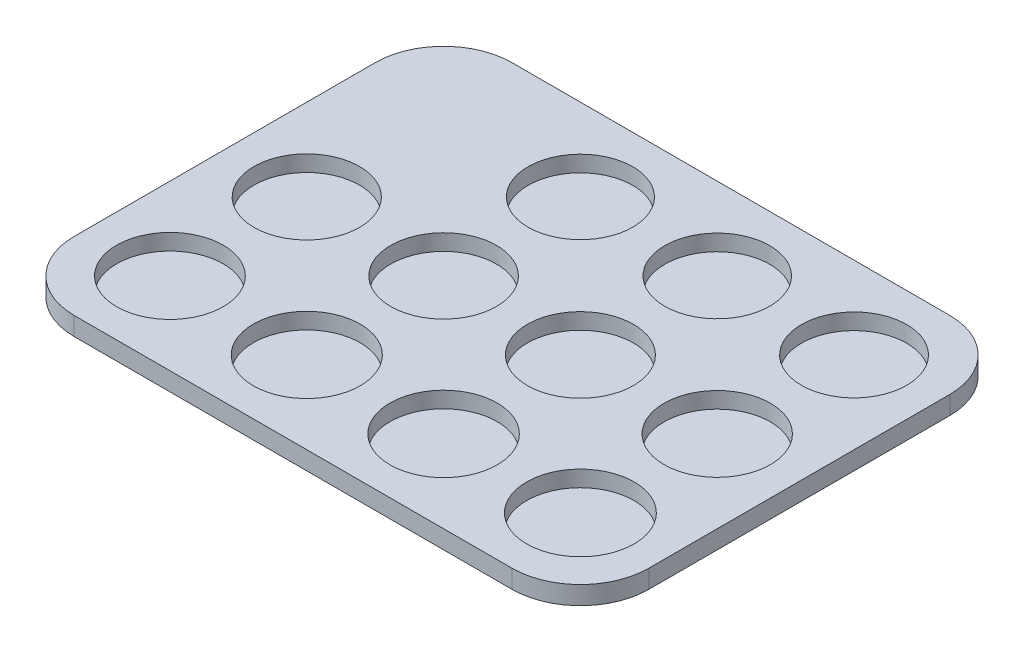
ISO-10303-21;
HEADER;
FILE_DESCRIPTION(('STEP AP214'),'2;1');
FILE_NAME('part.step','',(''),(''),'','','');
FILE_SCHEMA(('AUTOMOTIVE_DESIGN { 1 0 10303 214 1 1 1 1 }'));
ENDSEC;
DATA;
#1=APPLICATION_CONTEXT('core data for automotive mechanical design processes');
#2=APPLICATION_PROTOCOL_DEFINITION('international standard','automotive_design',2000,#1);
#3=PRODUCT_CONTEXT('',#1,'mechanical');
#4=PRODUCT('Part','Part','',(#3));
#5=PRODUCT_RELATED_PRODUCT_CATEGORY('part','',(#4));
#6=PRODUCT_DEFINITION_FORMATION('','',#4);
#7=PRODUCT_DEFINITION_CONTEXT('part definition',#1,'design');
#8=PRODUCT_DEFINITION('design','',#6,#7);
#9=PRODUCT_DEFINITION_SHAPE('','',#8);
#10=(LENGTH_UNIT() NAMED_UNIT(*) SI_UNIT(.MILLI.,.METRE.));
#11=(NAMED_UNIT(*) PLANE_ANGLE_UNIT() SI_UNIT($,.RADIAN.));
#12=(NAMED_UNIT(*) SI_UNIT($,.STERADIAN.) SOLID_ANGLE_UNIT());
#13=UNCERTAINTY_MEASURE_WITH_UNIT(LENGTH_MEASURE(1.E-05),#10,'distance_accuracy_value','');
#14=(GEOMETRIC_REPRESENTATION_CONTEXT(3) GLOBAL_UNCERTAINTY_ASSIGNED_CONTEXT((#13)) GLOBAL_UNIT_ASSIGNED_CONTEXT((#10,
#11,#12)) REPRESENTATION_CONTEXT('',''));
#15=CARTESIAN_POINT('',(0.,0.,0.));
#16=DIRECTION('',(0.,0.,1.));
#17=DIRECTION('',(1.,0.,0.));
#18=AXIS2_PLACEMENT_3D('',#15,#16,#17);
#19=CARTESIAN_POINT('',(0.,3.,0.));
#20=DIRECTION('',(0.,-1.,0.));
#21=DIRECTION('',(0.,0.,-1.));
#22=AXIS2_PLACEMENT_3D('',#19,#20,#21);
#23=PLANE('',#22);
#24=DIRECTION('',(-1.,0.,0.));
#25=VECTOR('',#24,1.);
#26=CARTESIAN_POINT('',(0.,3.,-81.28));
#27=LINE('',#26,#25);
#28=CARTESIAN_POINT('',(93.98,3.,-81.28));
#29=VERTEX_POINT('',#28);
#30=CARTESIAN_POINT('',(12.7,3.,-81.28));
#31=VERTEX_POINT('',#30);
#32=EDGE_CURVE('E130',#29,#31,#27,.T.);
#33=ORIENTED_EDGE('',*,*,#32,.T.);
#34=CARTESIAN_POINT('',(12.7,3.,-68.58));
#35=DIRECTION('',(0.,-1.,0.));
#36=DIRECTION('',(0.,0.,-1.));
#37=AXIS2_PLACEMENT_3D('',#34,#35,#36);
#38=CIRCLE('',#37,12.7);
#39=CARTESIAN_POINT('',(0.,3.,-68.58));
#40=VERTEX_POINT('',#39);
#41=EDGE_CURVE('E152',#31,#40,#38,.F.);
#42=ORIENTED_EDGE('',*,*,#41,.T.);
#43=DIRECTION('',(0.,0.,1.));
#44=VECTOR('',#43,1.);
#45=CARTESIAN_POINT('',(0.,3.,0.));
#46=LINE('',#45,#44);
#47=CARTESIAN_POINT('',(0.,3.,-12.7));
#48=VERTEX_POINT('',#47);
#49=EDGE_CURVE('E162',#40,#48,#46,.T.);
#50=ORIENTED_EDGE('',*,*,#49,.T.);
#51=CARTESIAN_POINT('',(12.7,3.,-12.7));
#52=DIRECTION('',(0.,-1.,0.));
#53=DIRECTION('',(0.,0.,-1.));
#54=AXIS2_PLACEMENT_3D('',#51,#52,#53);
#55=CIRCLE('',#54,12.7);
#56=CARTESIAN_POINT('',(12.7,3.,0.));
#57=VERTEX_POINT('',#56);
#58=EDGE_CURVE('E129',#48,#57,#55,.F.);
#59=ORIENTED_EDGE('',*,*,#58,.T.);
#60=DIRECTION('',(1.,0.,0.));
#61=VECTOR('',#60,1.);
#62=CARTESIAN_POINT('',(0.,3.,0.));
#63=LINE('',#62,#61);
#64=CARTESIAN_POINT('',(93.98,3.,0.));
#65=VERTEX_POINT('',#64);
#66=EDGE_CURVE('E161',#57,#65,#63,.T.);
#67=ORIENTED_EDGE('',*,*,#66,.T.);
#68=CARTESIAN_POINT('',(93.98,3.,-12.7));
#69=DIRECTION('',(0.,-1.,0.));
#70=DIRECTION('',(0.,0.,-1.));
#71=AXIS2_PLACEMENT_3D('',#68,#69,#70);
#72=CIRCLE('',#71,12.7);
#73=CARTESIAN_POINT('',(106.68,3.,-12.7));
#74=VERTEX_POINT('',#73);
#75=EDGE_CURVE('E61',#65,#74,#72,.F.);
#76=ORIENTED_EDGE('',*,*,#75,.T.);
#77=DIRECTION('',(0.,0.,-1.));
#78=VECTOR('',#77,1.);
#79=CARTESIAN_POINT('',(106.68,3.,0.));
#80=LINE('',#79,#78);
#81=CARTESIAN_POINT('',(106.68,3.,-68.58));
#82=VERTEX_POINT('',#81);
#83=EDGE_CURVE('E134',#74,#82,#80,.T.);
#84=ORIENTED_EDGE('',*,*,#83,.T.);
#85=CARTESIAN_POINT('',(93.98,3.,-68.58));
#86=DIRECTION('',(0.,-1.,0.));
#87=DIRECTION('',(0.,0.,-1.));
#88=AXIS2_PLACEMENT_3D('',#85,#86,#87);
#89=CIRCLE('',#88,12.7);
#90=EDGE_CURVE('E150',#82,#29,#89,.F.);
#91=ORIENTED_EDGE('',*,*,#90,.T.);
#92=EDGE_LOOP('',(#33,#42,#50,#59,#67,#76,#84,#91));
#93=FACE_BOUND('',#92,.T.);
#94=CARTESIAN_POINT('',(15.24,3.,-40.64));
#95=DIRECTION('',(0.,1.,0.));
#96=DIRECTION('',(0.,0.,1.));
#97=AXIS2_PLACEMENT_3D('',#94,#95,#96);
#98=CIRCLE('',#97,9.80000000000001);
#99=CARTESIAN_POINT('',(15.24,3.,-30.84));
#100=VERTEX_POINT('',#99);
#101=EDGE_CURVE('E164',#100,#100,#98,.T.);
#102=ORIENTED_EDGE('',*,*,#101,.F.);
#103=EDGE_LOOP('',(#102));
#104=FACE_BOUND('',#103,.T.);
#105=CARTESIAN_POINT('',(40.64,3.,-40.64));
#106=DIRECTION('',(0.,1.,0.));
#107=DIRECTION('',(0.,0.,1.));
#108=AXIS2_PLACEMENT_3D('',#105,#106,#107);
#109=CIRCLE('',#108,9.82500000000002);
#110=CARTESIAN_POINT('',(40.64,3.,-30.815));
#111=VERTEX_POINT('',#110);
#112=EDGE_CURVE('E170',#111,#111,#109,.T.);
#113=ORIENTED_EDGE('',*,*,#112,.F.);
#114=EDGE_LOOP('',(#113));
#115=FACE_BOUND('',#114,.T.);
#116=CARTESIAN_POINT('',(66.04,3.,-40.64));
#117=DIRECTION('',(0.,1.,0.));
#118=DIRECTION('',(0.,0.,1.));
#119=AXIS2_PLACEMENT_3D('',#116,#117,#118);
#120=CIRCLE('',#119,9.84999999999999);
#121=CARTESIAN_POINT('',(66.04,3.,-30.79));
#122=VERTEX_POINT('',#121);
#123=EDGE_CURVE('E176',#122,#122,#120,.T.);
#124=ORIENTED_EDGE('',*,*,#123,.F.);
#125=EDGE_LOOP('',(#124));
#126=FACE_BOUND('',#125,.T.);
#127=CARTESIAN_POINT('',(91.44,3.,-40.64));
#128=DIRECTION('',(0.,1.,0.));
#129=DIRECTION('',(0.,0.,1.));
#130=AXIS2_PLACEMENT_3D('',#127,#128,#129);
#131=CIRCLE('',#130,9.875);
#132=CARTESIAN_POINT('',(91.44,3.,-30.765));
#133=VERTEX_POINT('',#132);
#134=EDGE_CURVE('E182',#133,#133,#131,.T.);
#135=ORIENTED_EDGE('',*,*,#134,.F.);
#136=EDGE_LOOP('',(#135));
#137=FACE_BOUND('',#136,.T.);
#138=CARTESIAN_POINT('',(15.24,3.,-15.24));
#139=DIRECTION('',(0.,1.,0.));
#140=DIRECTION('',(0.,0.,1.));
#141=AXIS2_PLACEMENT_3D('',#138,#139,#140);
#142=CIRCLE('',#141,9.90000000000001);
#143=CARTESIAN_POINT('',(15.24,3.,-5.33999999999999));
#144=VERTEX_POINT('',#143);
#145=EDGE_CURVE('E188',#144,#144,#142,.T.);
#146=ORIENTED_EDGE('',*,*,#145,.F.);
#147=EDGE_LOOP('',(#146));
#148=FACE_BOUND('',#147,.T.);
#149=CARTESIAN_POINT('',(40.64,3.,-15.24));
#150=DIRECTION('',(0.,1.,0.));
#151=DIRECTION('',(0.,0.,1.));
#152=AXIS2_PLACEMENT_3D('',#149,#150,#151);
#153=CIRCLE('',#152,9.925);
#154=CARTESIAN_POINT('',(40.64,3.,-5.31499999999999));
#155=VERTEX_POINT('',#154);
#156=EDGE_CURVE('E194',#155,#155,#153,.T.);
#157=ORIENTED_EDGE('',*,*,#156,.F.);
#158=EDGE_LOOP('',(#157));
#159=FACE_BOUND('',#158,.T.);
#160=CARTESIAN_POINT('',(66.04,3.,-15.24));
#161=DIRECTION('',(0.,1.,0.));
#162=DIRECTION('',(0.,0.,1.));
#163=AXIS2_PLACEMENT_3D('',#160,#161,#162);
#164=CIRCLE('',#163,9.94999999999998);
#165=CARTESIAN_POINT('',(66.04,3.,-5.29000000000002));
#166=VERTEX_POINT('',#165);
#167=EDGE_CURVE('E200',#166,#166,#164,.T.);
#168=ORIENTED_EDGE('',*,*,#167,.F.);
#169=EDGE_LOOP('',(#168));
#170=FACE_BOUND('',#169,.T.);
#171=CARTESIAN_POINT('',(91.44,3.,-15.24));
#172=DIRECTION('',(0.,1.,0.));
#173=DIRECTION('',(0.,0.,1.));
#174=AXIS2_PLACEMENT_3D('',#171,#172,#173);
#175=CIRCLE('',#174,9.97500000000002);
#176=CARTESIAN_POINT('',(91.44,3.,-5.26499999999997));
#177=VERTEX_POINT('',#176);
#178=EDGE_CURVE('E206',#177,#177,#175,.T.);
#179=ORIENTED_EDGE('',*,*,#178,.F.);
#180=EDGE_LOOP('',(#179));
#181=FACE_BOUND('',#180,.T.);
#182=CARTESIAN_POINT('',(91.44,3.,-66.04));
#183=DIRECTION('',(0.,1.,0.));
#184=DIRECTION('',(0.,0.,1.));
#185=AXIS2_PLACEMENT_3D('',#182,#183,#184);
#186=CIRCLE('',#185,9.77500000000001);
#187=CARTESIAN_POINT('',(91.44,3.,-56.265));
#188=VERTEX_POINT('',#187);
#189=EDGE_CURVE('E212',#188,#188,#186,.T.);
#190=ORIENTED_EDGE('',*,*,#189,.F.);
#191=EDGE_LOOP('',(#190));
#192=FACE_BOUND('',#191,.T.);
#193=CARTESIAN_POINT('',(66.04,3.,-66.04));
#194=DIRECTION('',(0.,1.,0.));
#195=DIRECTION('',(0.,0.,1.));
#196=AXIS2_PLACEMENT_3D('',#193,#194,#195);
#197=CIRCLE('',#196,9.75000000000001);
#198=CARTESIAN_POINT('',(66.04,3.,-56.29));
#199=VERTEX_POINT('',#198);
#200=EDGE_CURVE('E218',#199,#199,#197,.T.);
#201=ORIENTED_EDGE('',*,*,#200,.F.);
#202=EDGE_LOOP('',(#201));
#203=FACE_BOUND('',#202,.T.);
#204=CARTESIAN_POINT('',(40.64,3.,-66.04));
#205=DIRECTION('',(0.,1.,0.));
#206=DIRECTION('',(0.,0.,1.));
#207=AXIS2_PLACEMENT_3D('',#204,#205,#206);
#208=CIRCLE('',#207,9.725);
#209=CARTESIAN_POINT('',(40.64,3.,-56.315));
#210=VERTEX_POINT('',#209);
#211=EDGE_CURVE('E224',#210,#210,#208,.T.);
#212=ORIENTED_EDGE('',*,*,#211,.F.);
#213=EDGE_LOOP('',(#212));
#214=FACE_BOUND('',#213,.T.);
#215=ADVANCED_FACE('F39',(#93,#104,#115,#126,#137,#148,#159,#170,#181,#192,#203,#214),#23,.F.);
#216=CARTESIAN_POINT('',(0.,3.,0.));
#217=DIRECTION('',(1.,0.,0.));
#218=DIRECTION('',(0.,0.,-1.));
#219=AXIS2_PLACEMENT_3D('',#216,#217,#218);
#220=PLANE('',#219);
#221=ORIENTED_EDGE('',*,*,#49,.F.);
#222=DIRECTION('',(0.,-1.,0.));
#223=VECTOR('',#222,1.);
#224=CARTESIAN_POINT('',(0.,3.,-68.58));
#225=LINE('',#224,#223);
#226=CARTESIAN_POINT('',(0.,-0.4,-68.58));
#227=VERTEX_POINT('',#226);
#228=EDGE_CURVE('E116',#40,#227,#225,.T.);
#229=ORIENTED_EDGE('',*,*,#228,.T.);
#230=DIRECTION('',(0.,0.,-1.));
#231=VECTOR('',#230,1.);
#232=CARTESIAN_POINT('',(0.,-0.4,0.));
#233=LINE('',#232,#231);
#234=CARTESIAN_POINT('',(0.,-0.4,-12.7));
#235=VERTEX_POINT('',#234);
#236=EDGE_CURVE('E108',#235,#227,#233,.T.);
#237=ORIENTED_EDGE('',*,*,#236,.F.);
#238=DIRECTION('',(0.,-1.,0.));
#239=VECTOR('',#238,1.);
#240=CARTESIAN_POINT('',(0.,3.,-12.7));
#241=LINE('',#240,#239);
#242=EDGE_CURVE('E122',#235,#48,#241,.F.);
#243=ORIENTED_EDGE('',*,*,#242,.T.);
#244=EDGE_LOOP('',(#221,#229,#237,#243));
#245=FACE_BOUND('',#244,.T.);
#246=ADVANCED_FACE('F121',(#245),#220,.F.);
#247=CARTESIAN_POINT('',(0.,3.,0.));
#248=DIRECTION('',(0.,0.,-1.));
#249=DIRECTION('',(-1.,0.,0.));
#250=AXIS2_PLACEMENT_3D('',#247,#248,#249);
#251=PLANE('',#250);
#252=DIRECTION('',(1.,0.,0.));
#253=VECTOR('',#252,1.);
#254=CARTESIAN_POINT('',(0.,-0.4,0.));
#255=LINE('',#254,#253);
#256=CARTESIAN_POINT('',(12.7,-0.4,0.));
#257=VERTEX_POINT('',#256);
#258=CARTESIAN_POINT('',(93.98,-0.4,0.));
#259=VERTEX_POINT('',#258);
#260=EDGE_CURVE('E110',#257,#259,#255,.T.);
#261=ORIENTED_EDGE('',*,*,#260,.T.);
#262=DIRECTION('',(0.,-1.,0.));
#263=VECTOR('',#262,1.);
#264=CARTESIAN_POINT('',(93.98,3.,0.));
#265=LINE('',#264,#263);
#266=EDGE_CURVE('E11',#259,#65,#265,.F.);
#267=ORIENTED_EDGE('',*,*,#266,.T.);
#268=ORIENTED_EDGE('',*,*,#66,.F.);
#269=DIRECTION('',(0.,-1.,0.));
#270=VECTOR('',#269,1.);
#271=CARTESIAN_POINT('',(12.7,3.,0.));
#272=LINE('',#271,#270);
#273=EDGE_CURVE('E47',#57,#257,#272,.T.);
#274=ORIENTED_EDGE('',*,*,#273,.T.);
#275=EDGE_LOOP('',(#261,#267,#268,#274));
#276=FACE_BOUND('',#275,.T.);
#277=ADVANCED_FACE('F159',(#276),#251,.F.);
#278=CARTESIAN_POINT('',(106.68,3.,0.));
#279=DIRECTION('',(-1.,0.,0.));
#280=DIRECTION('',(0.,0.,1.));
#281=AXIS2_PLACEMENT_3D('',#278,#279,#280);
#282=PLANE('',#281);
#283=DIRECTION('',(0.,0.,-1.));
#284=VECTOR('',#283,1.);
#285=CARTESIAN_POINT('',(106.68,-0.4,0.));
#286=LINE('',#285,#284);
#287=CARTESIAN_POINT('',(106.68,-0.4,-12.7));
#288=VERTEX_POINT('',#287);
#289=CARTESIAN_POINT('',(106.68,-0.4,-68.58));
#290=VERTEX_POINT('',#289);
#291=EDGE_CURVE('E233',#288,#290,#286,.T.);
#292=ORIENTED_EDGE('',*,*,#291,.T.);
#293=DIRECTION('',(0.,-1.,0.));
#294=VECTOR('',#293,1.);
#295=CARTESIAN_POINT('',(106.68,3.,-68.58));
#296=LINE('',#295,#294);
#297=EDGE_CURVE('E54',#290,#82,#296,.F.);
#298=ORIENTED_EDGE('',*,*,#297,.T.);
#299=ORIENTED_EDGE('',*,*,#83,.F.);
#300=DIRECTION('',(0.,-1.,0.));
#301=VECTOR('',#300,1.);
#302=CARTESIAN_POINT('',(106.68,3.,-12.7));
#303=LINE('',#302,#301);
#304=EDGE_CURVE('E154',#74,#288,#303,.T.);
#305=ORIENTED_EDGE('',*,*,#304,.T.);
#306=EDGE_LOOP('',(#292,#298,#299,#305));
#307=FACE_BOUND('',#306,.T.);
#308=ADVANCED_FACE('F236',(#307),#282,.F.);
#309=CARTESIAN_POINT('',(0.,3.,-81.28));
#310=DIRECTION('',(0.,0.,1.));
#311=DIRECTION('',(1.,0.,0.));
#312=AXIS2_PLACEMENT_3D('',#309,#310,#311);
#313=PLANE('',#312);
#314=DIRECTION('',(1.,0.,0.));
#315=VECTOR('',#314,1.);
#316=CARTESIAN_POINT('',(0.,-0.4,-81.28));
#317=LINE('',#316,#315);
#318=CARTESIAN_POINT('',(12.7,-0.4,-81.28));
#319=VERTEX_POINT('',#318);
#320=CARTESIAN_POINT('',(93.98,-0.4,-81.28));
#321=VERTEX_POINT('',#320);
#322=EDGE_CURVE('E126',#319,#321,#317,.T.);
#323=ORIENTED_EDGE('',*,*,#322,.F.);
#324=DIRECTION('',(0.,-1.,0.));
#325=VECTOR('',#324,1.);
#326=CARTESIAN_POINT('',(12.7,3.,-81.28));
#327=LINE('',#326,#325);
#328=EDGE_CURVE('E146',#319,#31,#327,.F.);
#329=ORIENTED_EDGE('',*,*,#328,.T.);
#330=ORIENTED_EDGE('',*,*,#32,.F.);
#331=DIRECTION('',(0.,-1.,0.));
#332=VECTOR('',#331,1.);
#333=CARTESIAN_POINT('',(93.98,3.,-81.28));
#334=LINE('',#333,#332);
#335=EDGE_CURVE('E143',#29,#321,#334,.T.);
#336=ORIENTED_EDGE('',*,*,#335,.T.);
#337=EDGE_LOOP('',(#323,#329,#330,#336));
#338=FACE_BOUND('',#337,.T.);
#339=ADVANCED_FACE('F247',(#338),#313,.F.);
#340=CARTESIAN_POINT('',(15.24,3.,-40.64));
#341=DIRECTION('',(0.,-1.,0.));
#342=DIRECTION('',(0.,0.,-1.));
#343=AXIS2_PLACEMENT_3D('',#340,#341,#342);
#344=CYLINDRICAL_SURFACE('',#343,9.80000000000001);
#345=ORIENTED_EDGE('',*,*,#101,.T.);
#346=EDGE_LOOP('',(#345));
#347=FACE_BOUND('',#346,.T.);
#348=CARTESIAN_POINT('',(15.24,0.,-40.64));
#349=DIRECTION('',(0.,1.,0.));
#350=DIRECTION('',(0.,0.,1.));
#351=AXIS2_PLACEMENT_3D('',#348,#349,#350);
#352=CIRCLE('',#351,9.80000000000001);
#353=CARTESIAN_POINT('',(15.24,0.,-30.84));
#354=VERTEX_POINT('',#353);
#355=EDGE_CURVE('E167',#354,#354,#352,.T.);
#356=ORIENTED_EDGE('',*,*,#355,.F.);
#357=EDGE_LOOP('',(#356));
#358=FACE_BOUND('',#357,.T.);
#359=ADVANCED_FACE('F269',(#347,#358),#344,.F.);
#360=CARTESIAN_POINT('',(40.64,3.,-40.64));
#361=DIRECTION('',(0.,-1.,0.));
#362=DIRECTION('',(0.,0.,-1.));
#363=AXIS2_PLACEMENT_3D('',#360,#361,#362);
#364=CYLINDRICAL_SURFACE('',#363,9.82500000000002);
#365=ORIENTED_EDGE('',*,*,#112,.T.);
#366=EDGE_LOOP('',(#365));
#367=FACE_BOUND('',#366,.T.);
#368=CARTESIAN_POINT('',(40.64,0.,-40.64));
#369=DIRECTION('',(0.,1.,0.));
#370=DIRECTION('',(0.,0.,1.));
#371=AXIS2_PLACEMENT_3D('',#368,#369,#370);
#372=CIRCLE('',#371,9.82500000000002);
#373=CARTESIAN_POINT('',(40.64,0.,-30.815));
#374=VERTEX_POINT('',#373);
#375=EDGE_CURVE('E173',#374,#374,#372,.T.);
#376=ORIENTED_EDGE('',*,*,#375,.F.);
#377=EDGE_LOOP('',(#376));
#378=FACE_BOUND('',#377,.T.);
#379=ADVANCED_FACE('F295',(#367,#378),#364,.F.);
#380=CARTESIAN_POINT('',(66.04,3.,-40.64));
#381=DIRECTION('',(0.,-1.,0.));
#382=DIRECTION('',(0.,0.,-1.));
#383=AXIS2_PLACEMENT_3D('',#380,#381,#382);
#384=CYLINDRICAL_SURFACE('',#383,9.84999999999999);
#385=ORIENTED_EDGE('',*,*,#123,.T.);
#386=EDGE_LOOP('',(#385));
#387=FACE_BOUND('',#386,.T.);
#388=CARTESIAN_POINT('',(66.04,0.,-40.64));
#389=DIRECTION('',(0.,1.,0.));
#390=DIRECTION('',(0.,0.,1.));
#391=AXIS2_PLACEMENT_3D('',#388,#389,#390);
#392=CIRCLE('',#391,9.84999999999999);
#393=CARTESIAN_POINT('',(66.04,0.,-30.79));
#394=VERTEX_POINT('',#393);
#395=EDGE_CURVE('E179',#394,#394,#392,.T.);
#396=ORIENTED_EDGE('',*,*,#395,.F.);
#397=EDGE_LOOP('',(#396));
#398=FACE_BOUND('',#397,.T.);
#399=ADVANCED_FACE('F302',(#387,#398),#384,.F.);
#400=CARTESIAN_POINT('',(91.44,3.,-40.64));
#401=DIRECTION('',(0.,-1.,0.));
#402=DIRECTION('',(0.,0.,-1.));
#403=AXIS2_PLACEMENT_3D('',#400,#401,#402);
#404=CYLINDRICAL_SURFACE('',#403,9.875);
#405=ORIENTED_EDGE('',*,*,#134,.T.);
#406=EDGE_LOOP('',(#405));
#407=FACE_BOUND('',#406,.T.);
#408=CARTESIAN_POINT('',(91.44,0.,-40.64));
#409=DIRECTION('',(0.,1.,0.));
#410=DIRECTION('',(0.,0.,1.));
#411=AXIS2_PLACEMENT_3D('',#408,#409,#410);
#412=CIRCLE('',#411,9.875);
#413=CARTESIAN_POINT('',(91.44,0.,-30.765));
#414=VERTEX_POINT('',#413);
#415=EDGE_CURVE('E185',#414,#414,#412,.T.);
#416=ORIENTED_EDGE('',*,*,#415,.F.);
#417=EDGE_LOOP('',(#416));
#418=FACE_BOUND('',#417,.T.);
#419=ADVANCED_FACE('F309',(#407,#418),#404,.F.);
#420=CARTESIAN_POINT('',(15.24,3.,-15.24));
#421=DIRECTION('',(0.,-1.,0.));
#422=DIRECTION('',(0.,0.,-1.));
#423=AXIS2_PLACEMENT_3D('',#420,#421,#422);
#424=CYLINDRICAL_SURFACE('',#423,9.90000000000001);
#425=ORIENTED_EDGE('',*,*,#145,.T.);
#426=EDGE_LOOP('',(#425));
#427=FACE_BOUND('',#426,.T.);
#428=CARTESIAN_POINT('',(15.24,0.,-15.24));
#429=DIRECTION('',(0.,1.,0.));
#430=DIRECTION('',(0.,0.,1.));
#431=AXIS2_PLACEMENT_3D('',#428,#429,#430);
#432=CIRCLE('',#431,9.90000000000001);
#433=CARTESIAN_POINT('',(15.24,0.,-5.33999999999999));
#434=VERTEX_POINT('',#433);
#435=EDGE_CURVE('E191',#434,#434,#432,.T.);
#436=ORIENTED_EDGE('',*,*,#435,.F.);
#437=EDGE_LOOP('',(#436));
#438=FACE_BOUND('',#437,.T.);
#439=ADVANCED_FACE('F317',(#427,#438),#424,.F.);
#440=CARTESIAN_POINT('',(40.64,3.,-15.24));
#441=DIRECTION('',(0.,-1.,0.));
#442=DIRECTION('',(0.,0.,-1.));
#443=AXIS2_PLACEMENT_3D('',#440,#441,#442);
#444=CYLINDRICAL_SURFACE('',#443,9.925);
#445=ORIENTED_EDGE('',*,*,#156,.T.);
#446=EDGE_LOOP('',(#445));
#447=FACE_BOUND('',#446,.T.);
#448=CARTESIAN_POINT('',(40.64,0.,-15.24));
#449=DIRECTION('',(0.,1.,0.));
#450=DIRECTION('',(0.,0.,1.));
#451=AXIS2_PLACEMENT_3D('',#448,#449,#450);
#452=CIRCLE('',#451,9.925);
#453=CARTESIAN_POINT('',(40.64,0.,-5.31499999999999));
#454=VERTEX_POINT('',#453);
#455=EDGE_CURVE('E197',#454,#454,#452,.T.);
#456=ORIENTED_EDGE('',*,*,#455,.F.);
#457=EDGE_LOOP('',(#456));
#458=FACE_BOUND('',#457,.T.);
#459=ADVANCED_FACE('F325',(#447,#458),#444,.F.);
#460=CARTESIAN_POINT('',(66.04,3.,-15.24));
#461=DIRECTION('',(0.,-1.,0.));
#462=DIRECTION('',(0.,0.,-1.));
#463=AXIS2_PLACEMENT_3D('',#460,#461,#462);
#464=CYLINDRICAL_SURFACE('',#463,9.94999999999998);
#465=ORIENTED_EDGE('',*,*,#167,.T.);
#466=EDGE_LOOP('',(#465));
#467=FACE_BOUND('',#466,.T.);
#468=CARTESIAN_POINT('',(66.04,0.,-15.24));
#469=DIRECTION('',(0.,1.,0.));
#470=DIRECTION('',(0.,0.,1.));
#471=AXIS2_PLACEMENT_3D('',#468,#469,#470);
#472=CIRCLE('',#471,9.94999999999998);
#473=CARTESIAN_POINT('',(66.04,0.,-5.29000000000002));
#474=VERTEX_POINT('',#473);
#475=EDGE_CURVE('E203',#474,#474,#472,.T.);
#476=ORIENTED_EDGE('',*,*,#475,.F.);
#477=EDGE_LOOP('',(#476));
#478=FACE_BOUND('',#477,.T.);
#479=ADVANCED_FACE('F333',(#467,#478),#464,.F.);
#480=CARTESIAN_POINT('',(91.44,3.,-15.24));
#481=DIRECTION('',(0.,-1.,0.));
#482=DIRECTION('',(0.,0.,-1.));
#483=AXIS2_PLACEMENT_3D('',#480,#481,#482);
#484=CYLINDRICAL_SURFACE('',#483,9.97500000000002);
#485=ORIENTED_EDGE('',*,*,#178,.T.);
#486=EDGE_LOOP('',(#485));
#487=FACE_BOUND('',#486,.T.);
#488=CARTESIAN_POINT('',(91.44,0.,-15.24));
#489=DIRECTION('',(0.,1.,0.));
#490=DIRECTION('',(0.,0.,1.));
#491=AXIS2_PLACEMENT_3D('',#488,#489,#490);
#492=CIRCLE('',#491,9.97500000000002);
#493=CARTESIAN_POINT('',(91.44,0.,-5.26499999999997));
#494=VERTEX_POINT('',#493);
#495=EDGE_CURVE('E209',#494,#494,#492,.T.);
#496=ORIENTED_EDGE('',*,*,#495,.F.);
#497=EDGE_LOOP('',(#496));
#498=FACE_BOUND('',#497,.T.);
#499=ADVANCED_FACE('F341',(#487,#498),#484,.F.);
#500=CARTESIAN_POINT('',(91.44,3.,-66.04));
#501=DIRECTION('',(0.,-1.,0.));
#502=DIRECTION('',(0.,0.,-1.));
#503=AXIS2_PLACEMENT_3D('',#500,#501,#502);
#504=CYLINDRICAL_SURFACE('',#503,9.77500000000001);
#505=ORIENTED_EDGE('',*,*,#189,.T.);
#506=EDGE_LOOP('',(#505));
#507=FACE_BOUND('',#506,.T.);
#508=CARTESIAN_POINT('',(91.44,0.,-66.04));
#509=DIRECTION('',(0.,1.,0.));
#510=DIRECTION('',(0.,0.,1.));
#511=AXIS2_PLACEMENT_3D('',#508,#509,#510);
#512=CIRCLE('',#511,9.77500000000001);
#513=CARTESIAN_POINT('',(91.44,0.,-56.265));
#514=VERTEX_POINT('',#513);
#515=EDGE_CURVE('E215',#514,#514,#512,.T.);
#516=ORIENTED_EDGE('',*,*,#515,.F.);
#517=EDGE_LOOP('',(#516));
#518=FACE_BOUND('',#517,.T.);
#519=ADVANCED_FACE('F349',(#507,#518),#504,.F.);
#520=CARTESIAN_POINT('',(66.04,3.,-66.04));
#521=DIRECTION('',(0.,-1.,0.));
#522=DIRECTION('',(0.,0.,-1.));
#523=AXIS2_PLACEMENT_3D('',#520,#521,#522);
#524=CYLINDRICAL_SURFACE('',#523,9.75000000000001);
#525=ORIENTED_EDGE('',*,*,#200,.T.);
#526=EDGE_LOOP('',(#525));
#527=FACE_BOUND('',#526,.T.);
#528=CARTESIAN_POINT('',(66.04,0.,-66.04));
#529=DIRECTION('',(0.,1.,0.));
#530=DIRECTION('',(0.,0.,1.));
#531=AXIS2_PLACEMENT_3D('',#528,#529,#530);
#532=CIRCLE('',#531,9.75000000000001);
#533=CARTESIAN_POINT('',(66.04,0.,-56.29));
#534=VERTEX_POINT('',#533);
#535=EDGE_CURVE('E221',#534,#534,#532,.T.);
#536=ORIENTED_EDGE('',*,*,#535,.F.);
#537=EDGE_LOOP('',(#536));
#538=FACE_BOUND('',#537,.T.);
#539=ADVANCED_FACE('F357',(#527,#538),#524,.F.);
#540=CARTESIAN_POINT('',(40.64,3.,-66.04));
#541=DIRECTION('',(0.,-1.,0.));
#542=DIRECTION('',(0.,0.,-1.));
#543=AXIS2_PLACEMENT_3D('',#540,#541,#542);
#544=CYLINDRICAL_SURFACE('',#543,9.725);
#545=ORIENTED_EDGE('',*,*,#211,.T.);
#546=EDGE_LOOP('',(#545));
#547=FACE_BOUND('',#546,.T.);
#548=CARTESIAN_POINT('',(40.64,0.,-66.04));
#549=DIRECTION('',(0.,1.,0.));
#550=DIRECTION('',(0.,0.,1.));
#551=AXIS2_PLACEMENT_3D('',#548,#549,#550);
#552=CIRCLE('',#551,9.725);
#553=CARTESIAN_POINT('',(40.64,0.,-56.315));
#554=VERTEX_POINT('',#553);
#555=EDGE_CURVE('E125',#554,#554,#552,.T.);
#556=ORIENTED_EDGE('',*,*,#555,.F.);
#557=EDGE_LOOP('',(#556));
#558=FACE_BOUND('',#557,.T.);
#559=ADVANCED_FACE('F365',(#547,#558),#544,.F.);
#560=CARTESIAN_POINT('',(0.,0.,0.));
#561=DIRECTION('',(0.,1.,0.));
#562=DIRECTION('',(0.,0.,1.));
#563=AXIS2_PLACEMENT_3D('',#560,#561,#562);
#564=PLANE('',#563);
#565=ORIENTED_EDGE('',*,*,#555,.T.);
#566=EDGE_LOOP('',(#565));
#567=FACE_BOUND('',#566,.T.);
#568=ADVANCED_FACE('F373',(#567),#564,.T.);
#569=ORIENTED_EDGE('',*,*,#515,.T.);
#570=EDGE_LOOP('',(#569));
#571=FACE_BOUND('',#570,.T.);
#572=ADVANCED_FACE('F381',(#571),#564,.T.);
#573=ORIENTED_EDGE('',*,*,#475,.T.);
#574=EDGE_LOOP('',(#573));
#575=FACE_BOUND('',#574,.T.);
#576=ADVANCED_FACE('F389',(#575),#564,.T.);
#577=ORIENTED_EDGE('',*,*,#435,.T.);
#578=EDGE_LOOP('',(#577));
#579=FACE_BOUND('',#578,.T.);
#580=ADVANCED_FACE('F396',(#579),#564,.T.);
#581=ORIENTED_EDGE('',*,*,#395,.T.);
#582=EDGE_LOOP('',(#581));
#583=FACE_BOUND('',#582,.T.);
#584=ADVANCED_FACE('F403',(#583),#564,.T.);
#585=ORIENTED_EDGE('',*,*,#355,.T.);
#586=EDGE_LOOP('',(#585));
#587=FACE_BOUND('',#586,.T.);
#588=ADVANCED_FACE('F410',(#587),#564,.T.);
#589=ORIENTED_EDGE('',*,*,#375,.T.);
#590=EDGE_LOOP('',(#589));
#591=FACE_BOUND('',#590,.T.);
#592=ADVANCED_FACE('F417',(#591),#564,.T.);
#593=ORIENTED_EDGE('',*,*,#415,.T.);
#594=EDGE_LOOP('',(#593));
#595=FACE_BOUND('',#594,.T.);
#596=ADVANCED_FACE('F424',(#595),#564,.T.);
#597=ORIENTED_EDGE('',*,*,#455,.T.);
#598=EDGE_LOOP('',(#597));
#599=FACE_BOUND('',#598,.T.);
#600=ADVANCED_FACE('F431',(#599),#564,.T.);
#601=ORIENTED_EDGE('',*,*,#495,.T.);
#602=EDGE_LOOP('',(#601));
#603=FACE_BOUND('',#602,.T.);
#604=ADVANCED_FACE('F438',(#603),#564,.T.);
#605=ORIENTED_EDGE('',*,*,#535,.T.);
#606=EDGE_LOOP('',(#605));
#607=FACE_BOUND('',#606,.T.);
#608=ADVANCED_FACE('F259',(#607),#564,.T.);
#609=CARTESIAN_POINT('',(0.,-0.4,0.));
#610=DIRECTION('',(0.,1.,0.));
#611=DIRECTION('',(0.,0.,1.));
#612=AXIS2_PLACEMENT_3D('',#609,#610,#611);
#613=PLANE('',#612);
#614=ORIENTED_EDGE('',*,*,#236,.T.);
#615=CARTESIAN_POINT('',(12.7,-0.4,-68.58));
#616=DIRECTION('',(0.,1.,0.));
#617=DIRECTION('',(0.,0.,1.));
#618=AXIS2_PLACEMENT_3D('',#615,#616,#617);
#619=CIRCLE('',#618,12.7);
#620=EDGE_CURVE('E141',#227,#319,#619,.F.);
#621=ORIENTED_EDGE('',*,*,#620,.T.);
#622=ORIENTED_EDGE('',*,*,#322,.T.);
#623=CARTESIAN_POINT('',(93.98,-0.4,-68.58));
#624=DIRECTION('',(0.,1.,0.));
#625=DIRECTION('',(0.,0.,1.));
#626=AXIS2_PLACEMENT_3D('',#623,#624,#625);
#627=CIRCLE('',#626,12.7);
#628=EDGE_CURVE('E139',#321,#290,#627,.F.);
#629=ORIENTED_EDGE('',*,*,#628,.T.);
#630=ORIENTED_EDGE('',*,*,#291,.F.);
#631=CARTESIAN_POINT('',(93.98,-0.4,-12.7));
#632=DIRECTION('',(0.,1.,0.));
#633=DIRECTION('',(0.,0.,1.));
#634=AXIS2_PLACEMENT_3D('',#631,#632,#633);
#635=CIRCLE('',#634,12.7);
#636=EDGE_CURVE('E115',#288,#259,#635,.F.);
#637=ORIENTED_EDGE('',*,*,#636,.T.);
#638=ORIENTED_EDGE('',*,*,#260,.F.);
#639=CARTESIAN_POINT('',(12.7,-0.4,-12.7));
#640=DIRECTION('',(0.,1.,0.));
#641=DIRECTION('',(0.,0.,1.));
#642=AXIS2_PLACEMENT_3D('',#639,#640,#641);
#643=CIRCLE('',#642,12.7);
#644=EDGE_CURVE('E105',#257,#235,#643,.F.);
#645=ORIENTED_EDGE('',*,*,#644,.T.);
#646=EDGE_LOOP('',(#614,#621,#622,#629,#630,#637,#638,#645));
#647=FACE_BOUND('',#646,.T.);
#648=ADVANCED_FACE('F107',(#647),#613,.F.);
#649=CARTESIAN_POINT('',(12.7,3.,-68.58));
#650=DIRECTION('',(0.,-1.,0.));
#651=DIRECTION('',(0.,0.,-1.));
#652=AXIS2_PLACEMENT_3D('',#649,#650,#651);
#653=CYLINDRICAL_SURFACE('',#652,12.7);
#654=ORIENTED_EDGE('',*,*,#41,.F.);
#655=ORIENTED_EDGE('',*,*,#328,.F.);
#656=ORIENTED_EDGE('',*,*,#620,.F.);
#657=ORIENTED_EDGE('',*,*,#228,.F.);
#658=EDGE_LOOP('',(#654,#655,#656,#657));
#659=FACE_BOUND('',#658,.T.);
#660=ADVANCED_FACE('F250',(#659),#653,.T.);
#661=CARTESIAN_POINT('',(93.98,3.,-68.58));
#662=DIRECTION('',(0.,-1.,0.));
#663=DIRECTION('',(0.,0.,-1.));
#664=AXIS2_PLACEMENT_3D('',#661,#662,#663);
#665=CYLINDRICAL_SURFACE('',#664,12.7);
#666=ORIENTED_EDGE('',*,*,#90,.F.);
#667=ORIENTED_EDGE('',*,*,#297,.F.);
#668=ORIENTED_EDGE('',*,*,#628,.F.);
#669=ORIENTED_EDGE('',*,*,#335,.F.);
#670=EDGE_LOOP('',(#666,#667,#668,#669));
#671=FACE_BOUND('',#670,.T.);
#672=ADVANCED_FACE('F240',(#671),#665,.T.);
#673=CARTESIAN_POINT('',(93.98,3.,-12.7));
#674=DIRECTION('',(0.,-1.,0.));
#675=DIRECTION('',(0.,0.,-1.));
#676=AXIS2_PLACEMENT_3D('',#673,#674,#675);
#677=CYLINDRICAL_SURFACE('',#676,12.7);
#678=ORIENTED_EDGE('',*,*,#75,.F.);
#679=ORIENTED_EDGE('',*,*,#266,.F.);
#680=ORIENTED_EDGE('',*,*,#636,.F.);
#681=ORIENTED_EDGE('',*,*,#304,.F.);
#682=EDGE_LOOP('',(#678,#679,#680,#681));
#683=FACE_BOUND('',#682,.T.);
#684=ADVANCED_FACE('F257',(#683),#677,.T.);
#685=CARTESIAN_POINT('',(12.7,3.,-12.7));
#686=DIRECTION('',(0.,-1.,0.));
#687=DIRECTION('',(0.,0.,-1.));
#688=AXIS2_PLACEMENT_3D('',#685,#686,#687);
#689=CYLINDRICAL_SURFACE('',#688,12.7);
#690=ORIENTED_EDGE('',*,*,#58,.F.);
#691=ORIENTED_EDGE('',*,*,#242,.F.);
#692=ORIENTED_EDGE('',*,*,#644,.F.);
#693=ORIENTED_EDGE('',*,*,#273,.F.);
#694=EDGE_LOOP('',(#690,#691,#692,#693));
#695=FACE_BOUND('',#694,.T.);
#696=ADVANCED_FACE('F41',(#695),#689,.T.);
#697=CLOSED_SHELL('',(#215,#246,#277,#308,#339,#359,#379,#399,#419,#439,#459,#479,#499,#519,
#539,#559,#568,#572,#576,#580,#584,#588,#592,#596,#600,#604,#608,#648,#660,#672,#684,#696));
#698=MANIFOLD_SOLID_BREP('B2',#697);
#699=ADVANCED_BREP_SHAPE_REPRESENTATION('',(#18,#698),#14);
#700=SHAPE_DEFINITION_REPRESENTATION(#9,#699);
ENDSEC;
END-ISO-10303-21;
